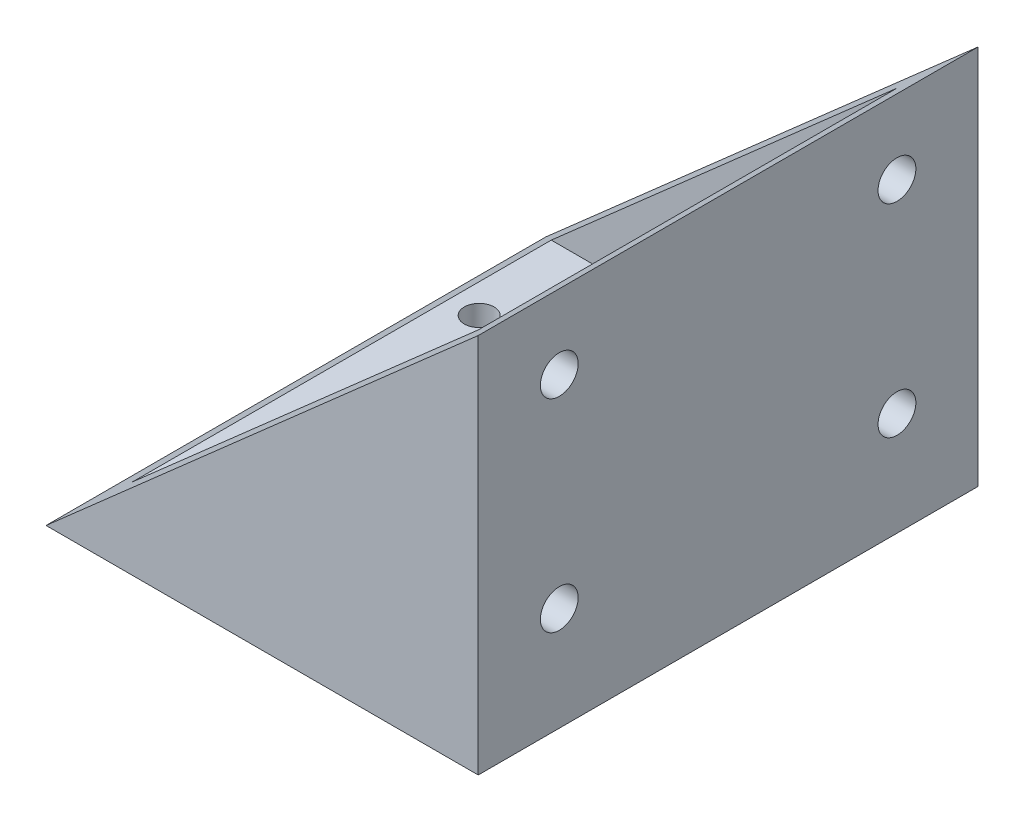
ISO-10303-21;
HEADER;
FILE_DESCRIPTION(('STEP AP214'),'2;1');
FILE_NAME('part.step','',(''),(''),'','','');
FILE_SCHEMA(('AUTOMOTIVE_DESIGN { 1 0 10303 214 1 1 1 1 }'));
ENDSEC;
DATA;
#1=APPLICATION_CONTEXT('core data for automotive mechanical design processes');
#2=APPLICATION_PROTOCOL_DEFINITION('international standard','automotive_design',2000,#1);
#3=PRODUCT_CONTEXT('',#1,'mechanical');
#4=PRODUCT('Part','Part','',(#3));
#5=PRODUCT_RELATED_PRODUCT_CATEGORY('part','',(#4));
#6=PRODUCT_DEFINITION_FORMATION('','',#4);
#7=PRODUCT_DEFINITION_CONTEXT('part definition',#1,'design');
#8=PRODUCT_DEFINITION('design','',#6,#7);
#9=PRODUCT_DEFINITION_SHAPE('','',#8);
#10=(LENGTH_UNIT() NAMED_UNIT(*) SI_UNIT(.MILLI.,.METRE.));
#11=(NAMED_UNIT(*) PLANE_ANGLE_UNIT() SI_UNIT($,.RADIAN.));
#12=(NAMED_UNIT(*) SI_UNIT($,.STERADIAN.) SOLID_ANGLE_UNIT());
#13=UNCERTAINTY_MEASURE_WITH_UNIT(LENGTH_MEASURE(1.E-05),#10,'distance_accuracy_value','');
#14=(GEOMETRIC_REPRESENTATION_CONTEXT(3) GLOBAL_UNCERTAINTY_ASSIGNED_CONTEXT((#13)) GLOBAL_UNIT_ASSIGNED_CONTEXT((#10,
#11,#12)) REPRESENTATION_CONTEXT('',''));
#15=CARTESIAN_POINT('',(0.,0.,0.));
#16=DIRECTION('',(0.,0.,1.));
#17=DIRECTION('',(1.,0.,0.));
#18=AXIS2_PLACEMENT_3D('',#15,#16,#17);
#19=CARTESIAN_POINT('',(32.,28.1797217645046,37.));
#20=DIRECTION('',(0.66088852188427,-0.750484084868976,0.));
#21=DIRECTION('',(0.750484084868976,0.66088852188427,0.));
#22=AXIS2_PLACEMENT_3D('',#19,#20,#21);
#23=PLANE('',#22);
#24=DIRECTION('',(-0.750484084868976,-0.66088852188427,0.));
#25=VECTOR('',#24,1.);
#26=CARTESIAN_POINT('',(32.,28.1797217645046,0.));
#27=LINE('',#26,#25);
#28=CARTESIAN_POINT('',(32.,28.1797217645046,0.));
#29=VERTEX_POINT('',#28);
#30=CARTESIAN_POINT('',(0.,0.,0.));
#31=VERTEX_POINT('',#30);
#32=EDGE_CURVE('E130',#29,#31,#27,.T.);
#33=ORIENTED_EDGE('',*,*,#32,.T.);
#34=DIRECTION('',(0.,0.,-1.));
#35=VECTOR('',#34,1.);
#36=CARTESIAN_POINT('',(0.,0.,37.));
#37=LINE('',#36,#35);
#38=CARTESIAN_POINT('',(0.,0.,37.));
#39=VERTEX_POINT('',#38);
#40=EDGE_CURVE('E11',#39,#31,#37,.T.);
#41=ORIENTED_EDGE('',*,*,#40,.F.);
#42=DIRECTION('',(-0.750484084868976,-0.66088852188427,0.));
#43=VECTOR('',#42,1.);
#44=CARTESIAN_POINT('',(32.,28.1797217645046,37.));
#45=LINE('',#44,#43);
#46=CARTESIAN_POINT('',(32.,28.1797217645046,37.));
#47=VERTEX_POINT('',#46);
#48=EDGE_CURVE('E135',#47,#39,#45,.T.);
#49=ORIENTED_EDGE('',*,*,#48,.F.);
#50=DIRECTION('',(0.,0.,-1.));
#51=VECTOR('',#50,1.);
#52=CARTESIAN_POINT('',(32.,28.1797217645046,37.));
#53=LINE('',#52,#51);
#54=EDGE_CURVE('E139',#47,#29,#53,.T.);
#55=ORIENTED_EDGE('',*,*,#54,.T.);
#56=EDGE_LOOP('',(#33,#41,#49,#55));
#57=FACE_BOUND('',#56,.T.);
#58=DIRECTION('',(-0.750484084868976,-0.66088852188427,0.));
#59=VECTOR('',#58,1.);
#60=CARTESIAN_POINT('',(0.,0.,3.));
#61=LINE('',#60,#59);
#62=CARTESIAN_POINT('',(29.,25.5378728490823,3.));
#63=VERTEX_POINT('',#62);
#64=CARTESIAN_POINT('',(3.40670503428896,3.,3.));
#65=VERTEX_POINT('',#64);
#66=EDGE_CURVE('E109',#63,#65,#61,.T.);
#67=ORIENTED_EDGE('',*,*,#66,.F.);
#68=DIRECTION('',(0.,0.,-1.));
#69=VECTOR('',#68,1.);
#70=CARTESIAN_POINT('',(29.,25.5378728490823,37.));
#71=LINE('',#70,#69);
#72=CARTESIAN_POINT('',(29.,25.5378728490823,34.));
#73=VERTEX_POINT('',#72);
#74=EDGE_CURVE('E120',#73,#63,#71,.T.);
#75=ORIENTED_EDGE('',*,*,#74,.F.);
#76=DIRECTION('',(-0.750484084868976,-0.66088852188427,0.));
#77=VECTOR('',#76,1.);
#78=CARTESIAN_POINT('',(0.,0.,34.));
#79=LINE('',#78,#77);
#80=CARTESIAN_POINT('',(3.40670503428896,3.,34.));
#81=VERTEX_POINT('',#80);
#82=EDGE_CURVE('E55',#73,#81,#79,.T.);
#83=ORIENTED_EDGE('',*,*,#82,.T.);
#84=DIRECTION('',(0.,0.,-1.));
#85=VECTOR('',#84,1.);
#86=CARTESIAN_POINT('',(3.40670503428896,3.,37.));
#87=LINE('',#86,#85);
#88=EDGE_CURVE('E119',#81,#65,#87,.T.);
#89=ORIENTED_EDGE('',*,*,#88,.T.);
#90=EDGE_LOOP('',(#67,#75,#83,#89));
#91=FACE_BOUND('',#90,.T.);
#92=ADVANCED_FACE('F39',(#57,#91),#23,.F.);
#93=CARTESIAN_POINT('',(0.,0.,37.));
#94=DIRECTION('',(0.,1.,0.));
#95=DIRECTION('',(0.,0.,1.));
#96=AXIS2_PLACEMENT_3D('',#93,#94,#95);
#97=PLANE('',#96);
#98=CARTESIAN_POINT('',(16.07,0.,10.5));
#99=DIRECTION('',(0.,-1.,0.));
#100=DIRECTION('',(0.,0.,-1.));
#101=AXIS2_PLACEMENT_3D('',#98,#99,#100);
#102=CIRCLE('',#101,6.5);
#103=CARTESIAN_POINT('',(16.07,0.,4.));
#104=VERTEX_POINT('',#103);
#105=EDGE_CURVE('E163',#104,#104,#102,.T.);
#106=ORIENTED_EDGE('',*,*,#105,.F.);
#107=EDGE_LOOP('',(#106));
#108=FACE_BOUND('',#107,.T.);
#109=CARTESIAN_POINT('',(26.57,0.,31.5));
#110=DIRECTION('',(0.,-1.,0.));
#111=DIRECTION('',(0.,0.,-1.));
#112=AXIS2_PLACEMENT_3D('',#109,#110,#111);
#113=CIRCLE('',#112,1.1);
#114=CARTESIAN_POINT('',(26.57,0.,30.4));
#115=VERTEX_POINT('',#114);
#116=EDGE_CURVE('E162',#115,#115,#113,.T.);
#117=ORIENTED_EDGE('',*,*,#116,.F.);
#118=EDGE_LOOP('',(#117));
#119=FACE_BOUND('',#118,.T.);
#120=CARTESIAN_POINT('',(5.57,0.,31.5));
#121=DIRECTION('',(0.,-1.,0.));
#122=DIRECTION('',(0.,0.,-1.));
#123=AXIS2_PLACEMENT_3D('',#120,#121,#122);
#124=CIRCLE('',#123,1.1);
#125=CARTESIAN_POINT('',(5.57,0.,30.4));
#126=VERTEX_POINT('',#125);
#127=EDGE_CURVE('E187',#126,#126,#124,.T.);
#128=ORIENTED_EDGE('',*,*,#127,.F.);
#129=EDGE_LOOP('',(#128));
#130=FACE_BOUND('',#129,.T.);
#131=CARTESIAN_POINT('',(5.57,0.,10.5));
#132=DIRECTION('',(0.,-1.,0.));
#133=DIRECTION('',(0.,0.,-1.));
#134=AXIS2_PLACEMENT_3D('',#131,#132,#133);
#135=CIRCLE('',#134,1.1);
#136=CARTESIAN_POINT('',(5.57,0.,9.4));
#137=VERTEX_POINT('',#136);
#138=EDGE_CURVE('E184',#137,#137,#135,.T.);
#139=ORIENTED_EDGE('',*,*,#138,.F.);
#140=EDGE_LOOP('',(#139));
#141=FACE_BOUND('',#140,.T.);
#142=CARTESIAN_POINT('',(26.57,0.,10.5));
#143=DIRECTION('',(0.,-1.,0.));
#144=DIRECTION('',(0.,0.,-1.));
#145=AXIS2_PLACEMENT_3D('',#142,#143,#144);
#146=CIRCLE('',#145,1.1);
#147=CARTESIAN_POINT('',(26.57,0.,9.4));
#148=VERTEX_POINT('',#147);
#149=EDGE_CURVE('E151',#148,#148,#146,.T.);
#150=ORIENTED_EDGE('',*,*,#149,.F.);
#151=EDGE_LOOP('',(#150));
#152=FACE_BOUND('',#151,.T.);
#153=DIRECTION('',(1.,0.,0.));
#154=VECTOR('',#153,1.);
#155=CARTESIAN_POINT('',(0.,0.,0.));
#156=LINE('',#155,#154);
#157=CARTESIAN_POINT('',(32.,0.,0.));
#158=VERTEX_POINT('',#157);
#159=EDGE_CURVE('E142',#31,#158,#156,.T.);
#160=ORIENTED_EDGE('',*,*,#159,.T.);
#161=DIRECTION('',(0.,0.,-1.));
#162=VECTOR('',#161,1.);
#163=CARTESIAN_POINT('',(32.,0.,37.));
#164=LINE('',#163,#162);
#165=CARTESIAN_POINT('',(32.,0.,37.));
#166=VERTEX_POINT('',#165);
#167=EDGE_CURVE('E47',#166,#158,#164,.T.);
#168=ORIENTED_EDGE('',*,*,#167,.F.);
#169=DIRECTION('',(1.,0.,0.));
#170=VECTOR('',#169,1.);
#171=CARTESIAN_POINT('',(0.,0.,37.));
#172=LINE('',#171,#170);
#173=EDGE_CURVE('E86',#39,#166,#172,.T.);
#174=ORIENTED_EDGE('',*,*,#173,.F.);
#175=ORIENTED_EDGE('',*,*,#40,.T.);
#176=EDGE_LOOP('',(#160,#168,#174,#175));
#177=FACE_BOUND('',#176,.T.);
#178=ADVANCED_FACE('F197',(#108,#119,#130,#141,#152,#177),#97,.F.);
#179=CARTESIAN_POINT('',(32.,0.,37.));
#180=DIRECTION('',(-1.,0.,0.));
#181=DIRECTION('',(0.,0.,1.));
#182=AXIS2_PLACEMENT_3D('',#179,#180,#181);
#183=PLANE('',#182);
#184=CARTESIAN_POINT('',(32.,22.6797217645046,6.));
#185=DIRECTION('',(1.,0.,0.));
#186=DIRECTION('',(0.,0.,-1.));
#187=AXIS2_PLACEMENT_3D('',#184,#185,#186);
#188=CIRCLE('',#187,1.4);
#189=CARTESIAN_POINT('',(32.,22.6797217645046,4.6));
#190=VERTEX_POINT('',#189);
#191=EDGE_CURVE('E426',#190,#190,#188,.T.);
#192=ORIENTED_EDGE('',*,*,#191,.F.);
#193=EDGE_LOOP('',(#192));
#194=FACE_BOUND('',#193,.T.);
#195=CARTESIAN_POINT('',(32.,7.67972176450464,31.));
#196=DIRECTION('',(1.,0.,0.));
#197=DIRECTION('',(0.,0.,-1.));
#198=AXIS2_PLACEMENT_3D('',#195,#196,#197);
#199=CIRCLE('',#198,1.4);
#200=CARTESIAN_POINT('',(32.,7.67972176450464,29.6));
#201=VERTEX_POINT('',#200);
#202=EDGE_CURVE('E427',#201,#201,#199,.T.);
#203=ORIENTED_EDGE('',*,*,#202,.F.);
#204=EDGE_LOOP('',(#203));
#205=FACE_BOUND('',#204,.T.);
#206=CARTESIAN_POINT('',(32.,7.67972176450464,6.));
#207=DIRECTION('',(1.,0.,0.));
#208=DIRECTION('',(0.,0.,-1.));
#209=AXIS2_PLACEMENT_3D('',#206,#207,#208);
#210=CIRCLE('',#209,1.4);
#211=CARTESIAN_POINT('',(32.,7.67972176450464,4.6));
#212=VERTEX_POINT('',#211);
#213=EDGE_CURVE('E431',#212,#212,#210,.T.);
#214=ORIENTED_EDGE('',*,*,#213,.F.);
#215=EDGE_LOOP('',(#214));
#216=FACE_BOUND('',#215,.T.);
#217=CARTESIAN_POINT('',(32.,22.6797217645046,31.));
#218=DIRECTION('',(1.,0.,0.));
#219=DIRECTION('',(0.,0.,-1.));
#220=AXIS2_PLACEMENT_3D('',#217,#218,#219);
#221=CIRCLE('',#220,1.4);
#222=CARTESIAN_POINT('',(32.,22.6797217645046,29.6));
#223=VERTEX_POINT('',#222);
#224=EDGE_CURVE('E168',#223,#223,#221,.T.);
#225=ORIENTED_EDGE('',*,*,#224,.F.);
#226=EDGE_LOOP('',(#225));
#227=FACE_BOUND('',#226,.T.);
#228=DIRECTION('',(0.,1.,0.));
#229=VECTOR('',#228,1.);
#230=CARTESIAN_POINT('',(32.,0.,0.));
#231=LINE('',#230,#229);
#232=EDGE_CURVE('E81',#158,#29,#231,.T.);
#233=ORIENTED_EDGE('',*,*,#232,.T.);
#234=ORIENTED_EDGE('',*,*,#54,.F.);
#235=DIRECTION('',(0.,1.,0.));
#236=VECTOR('',#235,1.);
#237=CARTESIAN_POINT('',(32.,0.,37.));
#238=LINE('',#237,#236);
#239=EDGE_CURVE('E64',#166,#47,#238,.T.);
#240=ORIENTED_EDGE('',*,*,#239,.F.);
#241=ORIENTED_EDGE('',*,*,#167,.T.);
#242=EDGE_LOOP('',(#233,#234,#240,#241));
#243=FACE_BOUND('',#242,.T.);
#244=ADVANCED_FACE('F199',(#194,#205,#216,#227,#243),#183,.F.);
#245=CARTESIAN_POINT('',(0.,0.,37.));
#246=DIRECTION('',(0.,0.,-1.));
#247=DIRECTION('',(-1.,0.,0.));
#248=AXIS2_PLACEMENT_3D('',#245,#246,#247);
#249=PLANE('',#248);
#250=ORIENTED_EDGE('',*,*,#48,.T.);
#251=ORIENTED_EDGE('',*,*,#173,.T.);
#252=ORIENTED_EDGE('',*,*,#239,.T.);
#253=EDGE_LOOP('',(#250,#251,#252));
#254=FACE_BOUND('',#253,.T.);
#255=ADVANCED_FACE('F208',(#254),#249,.F.);
#256=CARTESIAN_POINT('',(0.,0.,0.));
#257=DIRECTION('',(0.,0.,-1.));
#258=DIRECTION('',(-1.,0.,0.));
#259=AXIS2_PLACEMENT_3D('',#256,#257,#258);
#260=PLANE('',#259);
#261=ORIENTED_EDGE('',*,*,#32,.F.);
#262=ORIENTED_EDGE('',*,*,#232,.F.);
#263=ORIENTED_EDGE('',*,*,#159,.F.);
#264=EDGE_LOOP('',(#261,#262,#263));
#265=FACE_BOUND('',#264,.T.);
#266=ADVANCED_FACE('F204',(#265),#260,.T.);
#267=CARTESIAN_POINT('',(0.,3.,37.));
#268=DIRECTION('',(0.,1.,0.));
#269=DIRECTION('',(0.,0.,1.));
#270=AXIS2_PLACEMENT_3D('',#267,#268,#269);
#271=PLANE('',#270);
#272=CARTESIAN_POINT('',(16.07,3.,10.5));
#273=DIRECTION('',(0.,1.,0.));
#274=DIRECTION('',(0.,0.,1.));
#275=AXIS2_PLACEMENT_3D('',#272,#273,#274);
#276=CIRCLE('',#275,6.5);
#277=CARTESIAN_POINT('',(16.07,3.,17.));
#278=VERTEX_POINT('',#277);
#279=EDGE_CURVE('E159',#278,#278,#276,.T.);
#280=ORIENTED_EDGE('',*,*,#279,.F.);
#281=EDGE_LOOP('',(#280));
#282=FACE_BOUND('',#281,.T.);
#283=CARTESIAN_POINT('',(26.57,3.,31.5));
#284=DIRECTION('',(0.,1.,0.));
#285=DIRECTION('',(0.,0.,1.));
#286=AXIS2_PLACEMENT_3D('',#283,#284,#285);
#287=CIRCLE('',#286,1.1);
#288=CARTESIAN_POINT('',(26.57,3.,32.6));
#289=VERTEX_POINT('',#288);
#290=EDGE_CURVE('E134',#289,#289,#287,.T.);
#291=ORIENTED_EDGE('',*,*,#290,.F.);
#292=EDGE_LOOP('',(#291));
#293=FACE_BOUND('',#292,.T.);
#294=CARTESIAN_POINT('',(5.57,3.,31.5));
#295=DIRECTION('',(0.,1.,0.));
#296=DIRECTION('',(0.,0.,1.));
#297=AXIS2_PLACEMENT_3D('',#294,#295,#296);
#298=CIRCLE('',#297,1.1);
#299=CARTESIAN_POINT('',(5.57,3.,32.6));
#300=VERTEX_POINT('',#299);
#301=EDGE_CURVE('E154',#300,#300,#298,.T.);
#302=ORIENTED_EDGE('',*,*,#301,.F.);
#303=EDGE_LOOP('',(#302));
#304=FACE_BOUND('',#303,.T.);
#305=CARTESIAN_POINT('',(5.57,3.,10.5));
#306=DIRECTION('',(0.,1.,0.));
#307=DIRECTION('',(0.,0.,1.));
#308=AXIS2_PLACEMENT_3D('',#305,#306,#307);
#309=CIRCLE('',#308,1.1);
#310=CARTESIAN_POINT('',(5.57,3.,11.6));
#311=VERTEX_POINT('',#310);
#312=EDGE_CURVE('E150',#311,#311,#309,.T.);
#313=ORIENTED_EDGE('',*,*,#312,.F.);
#314=EDGE_LOOP('',(#313));
#315=FACE_BOUND('',#314,.T.);
#316=CARTESIAN_POINT('',(26.57,3.,10.5));
#317=DIRECTION('',(0.,1.,0.));
#318=DIRECTION('',(0.,0.,1.));
#319=AXIS2_PLACEMENT_3D('',#316,#317,#318);
#320=CIRCLE('',#319,1.1);
#321=CARTESIAN_POINT('',(26.57,3.,11.6));
#322=VERTEX_POINT('',#321);
#323=EDGE_CURVE('E147',#322,#322,#320,.T.);
#324=ORIENTED_EDGE('',*,*,#323,.F.);
#325=EDGE_LOOP('',(#324));
#326=FACE_BOUND('',#325,.T.);
#327=DIRECTION('',(1.,0.,0.));
#328=VECTOR('',#327,1.);
#329=CARTESIAN_POINT('',(0.,3.,3.));
#330=LINE('',#329,#328);
#331=CARTESIAN_POINT('',(29.,3.,3.));
#332=VERTEX_POINT('',#331);
#333=EDGE_CURVE('E102',#65,#332,#330,.T.);
#334=ORIENTED_EDGE('',*,*,#333,.F.);
#335=ORIENTED_EDGE('',*,*,#88,.F.);
#336=DIRECTION('',(1.,0.,0.));
#337=VECTOR('',#336,1.);
#338=CARTESIAN_POINT('',(0.,3.,34.));
#339=LINE('',#338,#337);
#340=CARTESIAN_POINT('',(29.,3.,34.));
#341=VERTEX_POINT('',#340);
#342=EDGE_CURVE('E117',#81,#341,#339,.T.);
#343=ORIENTED_EDGE('',*,*,#342,.T.);
#344=DIRECTION('',(0.,0.,-1.));
#345=VECTOR('',#344,1.);
#346=CARTESIAN_POINT('',(29.,3.,37.));
#347=LINE('',#346,#345);
#348=EDGE_CURVE('E115',#341,#332,#347,.T.);
#349=ORIENTED_EDGE('',*,*,#348,.T.);
#350=EDGE_LOOP('',(#334,#335,#343,#349));
#351=FACE_BOUND('',#350,.T.);
#352=ADVANCED_FACE('F116',(#282,#293,#304,#315,#326,#351),#271,.T.);
#353=CARTESIAN_POINT('',(29.,0.,37.));
#354=DIRECTION('',(-1.,0.,0.));
#355=DIRECTION('',(0.,0.,1.));
#356=AXIS2_PLACEMENT_3D('',#353,#354,#355);
#357=PLANE('',#356);
#358=CARTESIAN_POINT('',(29.,22.6797217645046,6.));
#359=DIRECTION('',(-1.,0.,0.));
#360=DIRECTION('',(0.,0.,1.));
#361=AXIS2_PLACEMENT_3D('',#358,#359,#360);
#362=CIRCLE('',#361,1.4);
#363=CARTESIAN_POINT('',(29.,22.6797217645046,7.4));
#364=VERTEX_POINT('',#363);
#365=EDGE_CURVE('E42',#364,#364,#362,.T.);
#366=ORIENTED_EDGE('',*,*,#365,.F.);
#367=EDGE_LOOP('',(#366));
#368=FACE_BOUND('',#367,.T.);
#369=CARTESIAN_POINT('',(29.,7.67972176450464,31.));
#370=DIRECTION('',(-1.,0.,0.));
#371=DIRECTION('',(0.,0.,1.));
#372=AXIS2_PLACEMENT_3D('',#369,#370,#371);
#373=CIRCLE('',#372,1.4);
#374=CARTESIAN_POINT('',(29.,7.67972176450464,32.4));
#375=VERTEX_POINT('',#374);
#376=EDGE_CURVE('E170',#375,#375,#373,.T.);
#377=ORIENTED_EDGE('',*,*,#376,.F.);
#378=EDGE_LOOP('',(#377));
#379=FACE_BOUND('',#378,.T.);
#380=CARTESIAN_POINT('',(29.,7.67972176450464,6.));
#381=DIRECTION('',(-1.,0.,0.));
#382=DIRECTION('',(0.,0.,1.));
#383=AXIS2_PLACEMENT_3D('',#380,#381,#382);
#384=CIRCLE('',#383,1.4);
#385=CARTESIAN_POINT('',(29.,7.67972176450464,7.4));
#386=VERTEX_POINT('',#385);
#387=EDGE_CURVE('E167',#386,#386,#384,.T.);
#388=ORIENTED_EDGE('',*,*,#387,.F.);
#389=EDGE_LOOP('',(#388));
#390=FACE_BOUND('',#389,.T.);
#391=CARTESIAN_POINT('',(29.,22.6797217645046,31.));
#392=DIRECTION('',(-1.,0.,0.));
#393=DIRECTION('',(0.,0.,1.));
#394=AXIS2_PLACEMENT_3D('',#391,#392,#393);
#395=CIRCLE('',#394,1.4);
#396=CARTESIAN_POINT('',(29.,22.6797217645046,32.4));
#397=VERTEX_POINT('',#396);
#398=EDGE_CURVE('E164',#397,#397,#395,.T.);
#399=ORIENTED_EDGE('',*,*,#398,.F.);
#400=EDGE_LOOP('',(#399));
#401=FACE_BOUND('',#400,.T.);
#402=DIRECTION('',(0.,1.,0.));
#403=VECTOR('',#402,1.);
#404=CARTESIAN_POINT('',(29.,0.,3.));
#405=LINE('',#404,#403);
#406=EDGE_CURVE('E106',#332,#63,#405,.T.);
#407=ORIENTED_EDGE('',*,*,#406,.F.);
#408=ORIENTED_EDGE('',*,*,#348,.F.);
#409=DIRECTION('',(0.,1.,0.));
#410=VECTOR('',#409,1.);
#411=CARTESIAN_POINT('',(29.,0.,34.));
#412=LINE('',#411,#410);
#413=EDGE_CURVE('E128',#341,#73,#412,.T.);
#414=ORIENTED_EDGE('',*,*,#413,.T.);
#415=ORIENTED_EDGE('',*,*,#74,.T.);
#416=EDGE_LOOP('',(#407,#408,#414,#415));
#417=FACE_BOUND('',#416,.T.);
#418=ADVANCED_FACE('F122',(#368,#379,#390,#401,#417),#357,.T.);
#419=CARTESIAN_POINT('',(0.,0.,34.));
#420=DIRECTION('',(0.,0.,-1.));
#421=DIRECTION('',(-1.,0.,0.));
#422=AXIS2_PLACEMENT_3D('',#419,#420,#421);
#423=PLANE('',#422);
#424=ORIENTED_EDGE('',*,*,#82,.F.);
#425=ORIENTED_EDGE('',*,*,#413,.F.);
#426=ORIENTED_EDGE('',*,*,#342,.F.);
#427=EDGE_LOOP('',(#424,#425,#426));
#428=FACE_BOUND('',#427,.T.);
#429=ADVANCED_FACE('F250',(#428),#423,.T.);
#430=CARTESIAN_POINT('',(0.,0.,3.));
#431=DIRECTION('',(0.,0.,-1.));
#432=DIRECTION('',(-1.,0.,0.));
#433=AXIS2_PLACEMENT_3D('',#430,#431,#432);
#434=PLANE('',#433);
#435=ORIENTED_EDGE('',*,*,#66,.T.);
#436=ORIENTED_EDGE('',*,*,#333,.T.);
#437=ORIENTED_EDGE('',*,*,#406,.T.);
#438=EDGE_LOOP('',(#435,#436,#437));
#439=FACE_BOUND('',#438,.T.);
#440=ADVANCED_FACE('F104',(#439),#434,.F.);
#441=CARTESIAN_POINT('',(26.57,30.,10.5));
#442=DIRECTION('',(0.,-1.,0.));
#443=DIRECTION('',(0.,0.,-1.));
#444=AXIS2_PLACEMENT_3D('',#441,#442,#443);
#445=CYLINDRICAL_SURFACE('',#444,1.1);
#446=ORIENTED_EDGE('',*,*,#323,.T.);
#447=EDGE_LOOP('',(#446));
#448=FACE_BOUND('',#447,.T.);
#449=ORIENTED_EDGE('',*,*,#149,.T.);
#450=EDGE_LOOP('',(#449));
#451=FACE_BOUND('',#450,.T.);
#452=ADVANCED_FACE('F195',(#448,#451),#445,.F.);
#453=CARTESIAN_POINT('',(5.57,30.,10.5));
#454=DIRECTION('',(0.,-1.,0.));
#455=DIRECTION('',(0.,0.,-1.));
#456=AXIS2_PLACEMENT_3D('',#453,#454,#455);
#457=CYLINDRICAL_SURFACE('',#456,1.1);
#458=ORIENTED_EDGE('',*,*,#312,.T.);
#459=EDGE_LOOP('',(#458));
#460=FACE_BOUND('',#459,.T.);
#461=ORIENTED_EDGE('',*,*,#138,.T.);
#462=EDGE_LOOP('',(#461));
#463=FACE_BOUND('',#462,.T.);
#464=ADVANCED_FACE('F327',(#460,#463),#457,.F.);
#465=CARTESIAN_POINT('',(5.57,30.,31.5));
#466=DIRECTION('',(0.,-1.,0.));
#467=DIRECTION('',(0.,0.,-1.));
#468=AXIS2_PLACEMENT_3D('',#465,#466,#467);
#469=CYLINDRICAL_SURFACE('',#468,1.1);
#470=ORIENTED_EDGE('',*,*,#301,.T.);
#471=EDGE_LOOP('',(#470));
#472=FACE_BOUND('',#471,.T.);
#473=ORIENTED_EDGE('',*,*,#127,.T.);
#474=EDGE_LOOP('',(#473));
#475=FACE_BOUND('',#474,.T.);
#476=ADVANCED_FACE('F318',(#472,#475),#469,.F.);
#477=CARTESIAN_POINT('',(26.57,30.,31.5));
#478=DIRECTION('',(0.,-1.,0.));
#479=DIRECTION('',(0.,0.,-1.));
#480=AXIS2_PLACEMENT_3D('',#477,#478,#479);
#481=CYLINDRICAL_SURFACE('',#480,1.1);
#482=ORIENTED_EDGE('',*,*,#290,.T.);
#483=EDGE_LOOP('',(#482));
#484=FACE_BOUND('',#483,.T.);
#485=ORIENTED_EDGE('',*,*,#116,.T.);
#486=EDGE_LOOP('',(#485));
#487=FACE_BOUND('',#486,.T.);
#488=ADVANCED_FACE('F309',(#484,#487),#481,.F.);
#489=CARTESIAN_POINT('',(16.07,5.,10.5));
#490=DIRECTION('',(0.,-1.,0.));
#491=DIRECTION('',(0.,0.,-1.));
#492=AXIS2_PLACEMENT_3D('',#489,#490,#491);
#493=CYLINDRICAL_SURFACE('',#492,6.5);
#494=ORIENTED_EDGE('',*,*,#279,.T.);
#495=EDGE_LOOP('',(#494));
#496=FACE_BOUND('',#495,.T.);
#497=ORIENTED_EDGE('',*,*,#105,.T.);
#498=EDGE_LOOP('',(#497));
#499=FACE_BOUND('',#498,.T.);
#500=ADVANCED_FACE('F242',(#496,#499),#493,.F.);
#501=CARTESIAN_POINT('',(27.,22.6797217645046,31.));
#502=DIRECTION('',(1.,0.,0.));
#503=DIRECTION('',(0.,0.,-1.));
#504=AXIS2_PLACEMENT_3D('',#501,#502,#503);
#505=CYLINDRICAL_SURFACE('',#504,1.4);
#506=ORIENTED_EDGE('',*,*,#398,.T.);
#507=EDGE_LOOP('',(#506));
#508=FACE_BOUND('',#507,.T.);
#509=ORIENTED_EDGE('',*,*,#224,.T.);
#510=EDGE_LOOP('',(#509));
#511=FACE_BOUND('',#510,.T.);
#512=ADVANCED_FACE('F261',(#508,#511),#505,.F.);
#513=CARTESIAN_POINT('',(27.,7.67972176450464,6.));
#514=DIRECTION('',(1.,0.,0.));
#515=DIRECTION('',(0.,0.,-1.));
#516=AXIS2_PLACEMENT_3D('',#513,#514,#515);
#517=CYLINDRICAL_SURFACE('',#516,1.4);
#518=ORIENTED_EDGE('',*,*,#387,.T.);
#519=EDGE_LOOP('',(#518));
#520=FACE_BOUND('',#519,.T.);
#521=ORIENTED_EDGE('',*,*,#213,.T.);
#522=EDGE_LOOP('',(#521));
#523=FACE_BOUND('',#522,.T.);
#524=ADVANCED_FACE('F266',(#520,#523),#517,.F.);
#525=CARTESIAN_POINT('',(27.,7.67972176450464,31.));
#526=DIRECTION('',(1.,0.,0.));
#527=DIRECTION('',(0.,0.,-1.));
#528=AXIS2_PLACEMENT_3D('',#525,#526,#527);
#529=CYLINDRICAL_SURFACE('',#528,1.4);
#530=ORIENTED_EDGE('',*,*,#376,.T.);
#531=EDGE_LOOP('',(#530));
#532=FACE_BOUND('',#531,.T.);
#533=ORIENTED_EDGE('',*,*,#202,.T.);
#534=EDGE_LOOP('',(#533));
#535=FACE_BOUND('',#534,.T.);
#536=ADVANCED_FACE('F277',(#532,#535),#529,.F.);
#537=CARTESIAN_POINT('',(27.,22.6797217645046,6.));
#538=DIRECTION('',(1.,0.,0.));
#539=DIRECTION('',(0.,0.,-1.));
#540=AXIS2_PLACEMENT_3D('',#537,#538,#539);
#541=CYLINDRICAL_SURFACE('',#540,1.4);
#542=ORIENTED_EDGE('',*,*,#365,.T.);
#543=EDGE_LOOP('',(#542));
#544=FACE_BOUND('',#543,.T.);
#545=ORIENTED_EDGE('',*,*,#191,.T.);
#546=EDGE_LOOP('',(#545));
#547=FACE_BOUND('',#546,.T.);
#548=ADVANCED_FACE('F288',(#544,#547),#541,.F.);
#549=CLOSED_SHELL('',(#92,#178,#244,#255,#266,#352,#418,#429,#440,#452,#464,#476,#488,#500,#512,
#524,#536,#548));
#550=MANIFOLD_SOLID_BREP('B2',#549);
#551=ADVANCED_BREP_SHAPE_REPRESENTATION('',(#18,#550),#14);
#552=SHAPE_DEFINITION_REPRESENTATION(#9,#551);
ENDSEC;
END-ISO-10303-21;
